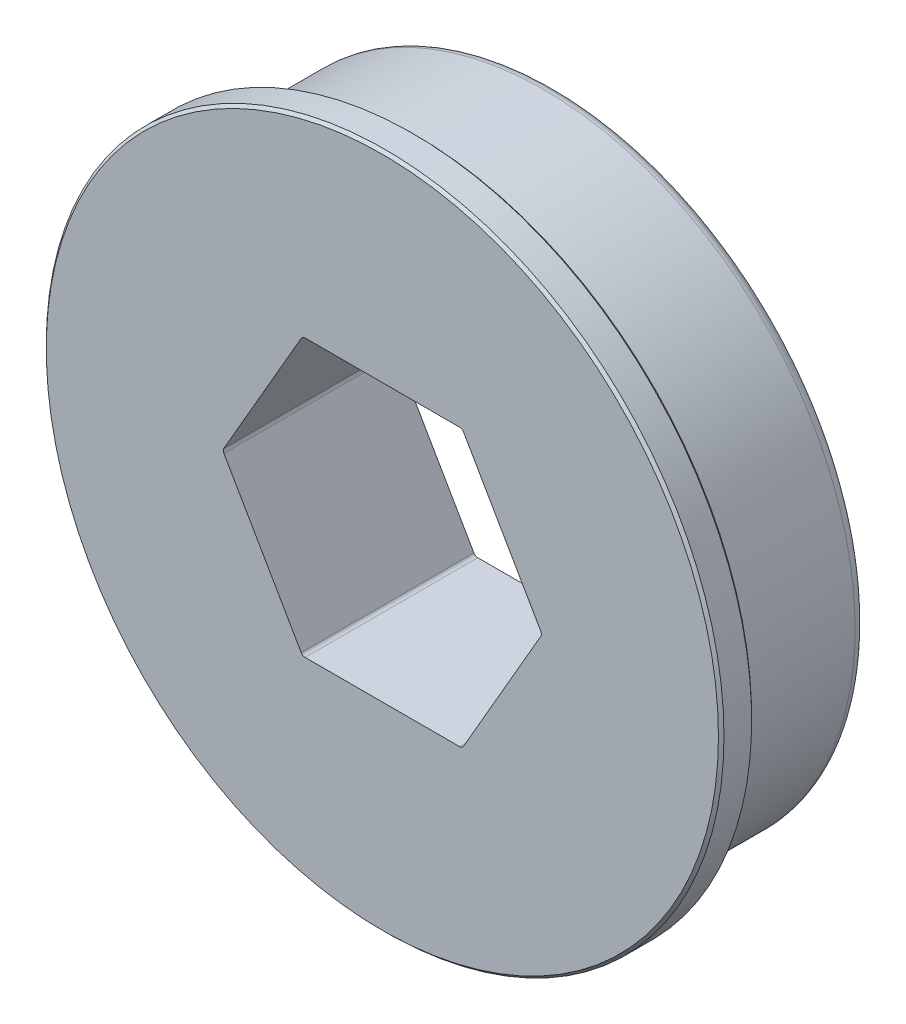
ISO-10303-21;
HEADER;
FILE_DESCRIPTION(('STEP AP214'),'2;1');
FILE_NAME('part.step','',(''),(''),'','','');
FILE_SCHEMA(('AUTOMOTIVE_DESIGN { 1 0 10303 214 1 1 1 1 }'));
ENDSEC;
DATA;
#1=APPLICATION_CONTEXT('core data for automotive mechanical design processes');
#2=APPLICATION_PROTOCOL_DEFINITION('international standard','automotive_design',2000,#1);
#3=PRODUCT_CONTEXT('',#1,'mechanical');
#4=PRODUCT('Part','Part','',(#3));
#5=PRODUCT_RELATED_PRODUCT_CATEGORY('part','',(#4));
#6=PRODUCT_DEFINITION_FORMATION('','',#4);
#7=PRODUCT_DEFINITION_CONTEXT('part definition',#1,'design');
#8=PRODUCT_DEFINITION('design','',#6,#7);
#9=PRODUCT_DEFINITION_SHAPE('','',#8);
#10=(LENGTH_UNIT() NAMED_UNIT(*) SI_UNIT(.MILLI.,.METRE.));
#11=(NAMED_UNIT(*) PLANE_ANGLE_UNIT() SI_UNIT($,.RADIAN.));
#12=(NAMED_UNIT(*) SI_UNIT($,.STERADIAN.) SOLID_ANGLE_UNIT());
#13=UNCERTAINTY_MEASURE_WITH_UNIT(LENGTH_MEASURE(1.E-05),#10,'distance_accuracy_value','');
#14=(GEOMETRIC_REPRESENTATION_CONTEXT(3) GLOBAL_UNCERTAINTY_ASSIGNED_CONTEXT((#13)) GLOBAL_UNIT_ASSIGNED_CONTEXT((#10,
#11,#12)) REPRESENTATION_CONTEXT('',''));
#15=CARTESIAN_POINT('',(0.,0.,0.));
#16=DIRECTION('',(0.,0.,1.));
#17=DIRECTION('',(1.,0.,0.));
#18=AXIS2_PLACEMENT_3D('',#15,#16,#17);
#19=CARTESIAN_POINT('',(0.,0.,7.92734));
#20=DIRECTION('',(0.,0.,-1.));
#21=DIRECTION('',(-1.,0.,0.));
#22=AXIS2_PLACEMENT_3D('',#19,#20,#21);
#23=CYLINDRICAL_SURFACE('',#22,15.5575);
#24=CARTESIAN_POINT('',(0.,0.,6.53034));
#25=DIRECTION('',(0.,0.,-1.));
#26=DIRECTION('',(-1.,0.,0.));
#27=AXIS2_PLACEMENT_3D('',#24,#25,#26);
#28=CIRCLE('',#27,15.5575);
#29=CARTESIAN_POINT('',(-15.5575,0.,6.53034));
#30=VERTEX_POINT('',#29);
#31=EDGE_CURVE('E190',#30,#30,#28,.F.);
#32=ORIENTED_EDGE('',*,*,#31,.T.);
#33=EDGE_LOOP('',(#32));
#34=FACE_BOUND('',#33,.T.);
#35=CARTESIAN_POINT('',(0.,0.,7.80034));
#36=DIRECTION('',(0.,0.,1.));
#37=DIRECTION('',(1.,0.,0.));
#38=AXIS2_PLACEMENT_3D('',#35,#36,#37);
#39=CIRCLE('',#38,15.5575);
#40=CARTESIAN_POINT('',(15.5575,0.,7.80034));
#41=VERTEX_POINT('',#40);
#42=EDGE_CURVE('E187',#41,#41,#39,.F.);
#43=ORIENTED_EDGE('',*,*,#42,.T.);
#44=EDGE_LOOP('',(#43));
#45=FACE_BOUND('',#44,.T.);
#46=ADVANCED_FACE('F39',(#34,#45),#23,.T.);
#47=CARTESIAN_POINT('',(15.5575,0.,7.92734));
#48=DIRECTION('',(0.,0.,1.));
#49=DIRECTION('',(1.,0.,0.));
#50=AXIS2_PLACEMENT_3D('',#47,#48,#49);
#51=PLANE('',#50);
#52=CARTESIAN_POINT('',(0.,0.,7.92734));
#53=DIRECTION('',(0.,0.,1.));
#54=DIRECTION('',(1.,0.,0.));
#55=AXIS2_PLACEMENT_3D('',#52,#53,#54);
#56=CIRCLE('',#55,15.4305);
#57=CARTESIAN_POINT('',(15.4305,0.,7.92734));
#58=VERTEX_POINT('',#57);
#59=EDGE_CURVE('E193',#58,#58,#56,.T.);
#60=ORIENTED_EDGE('',*,*,#59,.T.);
#61=EDGE_LOOP('',(#60));
#62=FACE_BOUND('',#61,.T.);
#63=DIRECTION('',(0.5,-0.866025403784439,0.));
#64=VECTOR('',#63,1.);
#65=CARTESIAN_POINT('',(-7.33234841870824,0.,7.92734));
#66=LINE('',#65,#64);
#67=CARTESIAN_POINT('',(-7.27368963135857,-0.101600000000002,7.92734));
#68=VERTEX_POINT('',#67);
#69=CARTESIAN_POINT('',(-3.72483299670378,-6.2484,7.92734));
#70=VERTEX_POINT('',#69);
#71=EDGE_CURVE('E164',#68,#70,#66,.T.);
#72=ORIENTED_EDGE('',*,*,#71,.F.);
#73=CARTESIAN_POINT('',(-7.09771326930957,0.,7.92734));
#74=DIRECTION('',(0.,0.,1.));
#75=DIRECTION('',(1.,0.,0.));
#76=AXIS2_PLACEMENT_3D('',#73,#74,#75);
#77=CIRCLE('',#76,0.2032);
#78=CARTESIAN_POINT('',(-7.27368963135857,0.101599999999998,7.92734));
#79=VERTEX_POINT('',#78);
#80=EDGE_CURVE('E230',#68,#79,#77,.F.);
#81=ORIENTED_EDGE('',*,*,#80,.T.);
#82=DIRECTION('',(-0.5,-0.866025403784439,0.));
#83=VECTOR('',#82,1.);
#84=CARTESIAN_POINT('',(-3.66617420935411,6.35,7.92734));
#85=LINE('',#84,#83);
#86=CARTESIAN_POINT('',(-3.72483299670378,6.2484,7.92734));
#87=VERTEX_POINT('',#86);
#88=EDGE_CURVE('E170',#87,#79,#85,.T.);
#89=ORIENTED_EDGE('',*,*,#88,.F.);
#90=CARTESIAN_POINT('',(-3.54885663465478,6.1468,7.92734));
#91=DIRECTION('',(0.,0.,1.));
#92=DIRECTION('',(1.,0.,0.));
#93=AXIS2_PLACEMENT_3D('',#90,#91,#92);
#94=CIRCLE('',#93,0.2032);
#95=CARTESIAN_POINT('',(-3.54885663465478,6.35,7.92734));
#96=VERTEX_POINT('',#95);
#97=EDGE_CURVE('E223',#87,#96,#94,.F.);
#98=ORIENTED_EDGE('',*,*,#97,.T.);
#99=DIRECTION('',(-1.,0.,0.));
#100=VECTOR('',#99,1.);
#101=CARTESIAN_POINT('',(3.66617420935413,6.35,7.92734));
#102=LINE('',#101,#100);
#103=CARTESIAN_POINT('',(3.5488566346548,6.35,7.92734));
#104=VERTEX_POINT('',#103);
#105=EDGE_CURVE('E162',#104,#96,#102,.T.);
#106=ORIENTED_EDGE('',*,*,#105,.F.);
#107=CARTESIAN_POINT('',(3.5488566346548,6.1468,7.92734));
#108=DIRECTION('',(0.,0.,1.));
#109=DIRECTION('',(1.,0.,0.));
#110=AXIS2_PLACEMENT_3D('',#107,#108,#109);
#111=CIRCLE('',#110,0.2032);
#112=CARTESIAN_POINT('',(3.7248329967038,6.2484,7.92734));
#113=VERTEX_POINT('',#112);
#114=EDGE_CURVE('E219',#104,#113,#111,.F.);
#115=ORIENTED_EDGE('',*,*,#114,.T.);
#116=DIRECTION('',(-0.5,0.866025403784439,0.));
#117=VECTOR('',#116,1.);
#118=CARTESIAN_POINT('',(7.33234841870826,0.,7.92734));
#119=LINE('',#118,#117);
#120=CARTESIAN_POINT('',(7.27368963135859,0.101599999999991,7.92734));
#121=VERTEX_POINT('',#120);
#122=EDGE_CURVE('E158',#121,#113,#119,.T.);
#123=ORIENTED_EDGE('',*,*,#122,.F.);
#124=CARTESIAN_POINT('',(7.09771326930959,0.,7.92734));
#125=DIRECTION('',(0.,0.,1.));
#126=DIRECTION('',(1.,0.,0.));
#127=AXIS2_PLACEMENT_3D('',#124,#125,#126);
#128=CIRCLE('',#127,0.2032);
#129=CARTESIAN_POINT('',(7.27368963135859,-0.101600000000007,7.92734));
#130=VERTEX_POINT('',#129);
#131=EDGE_CURVE('E157',#121,#130,#128,.F.);
#132=ORIENTED_EDGE('',*,*,#131,.T.);
#133=DIRECTION('',(0.5,0.866025403784439,0.));
#134=VECTOR('',#133,1.);
#135=CARTESIAN_POINT('',(3.66617420935414,-6.35,7.92734));
#136=LINE('',#135,#134);
#137=CARTESIAN_POINT('',(3.7248329967038,-6.2484,7.92734));
#138=VERTEX_POINT('',#137);
#139=EDGE_CURVE('E147',#138,#130,#136,.T.);
#140=ORIENTED_EDGE('',*,*,#139,.F.);
#141=CARTESIAN_POINT('',(3.54885663465481,-6.1468,7.92734));
#142=DIRECTION('',(0.,0.,1.));
#143=DIRECTION('',(1.,0.,0.));
#144=AXIS2_PLACEMENT_3D('',#141,#142,#143);
#145=CIRCLE('',#144,0.2032);
#146=CARTESIAN_POINT('',(3.54885663465481,-6.35,7.92734));
#147=VERTEX_POINT('',#146);
#148=EDGE_CURVE('E130',#138,#147,#145,.F.);
#149=ORIENTED_EDGE('',*,*,#148,.T.);
#150=DIRECTION('',(1.,0.,0.));
#151=VECTOR('',#150,1.);
#152=CARTESIAN_POINT('',(-3.66617420935412,-6.35,7.92734));
#153=LINE('',#152,#151);
#154=CARTESIAN_POINT('',(-3.54885663465479,-6.35,7.92734));
#155=VERTEX_POINT('',#154);
#156=EDGE_CURVE('E159',#155,#147,#153,.T.);
#157=ORIENTED_EDGE('',*,*,#156,.F.);
#158=CARTESIAN_POINT('',(-3.54885663465479,-6.1468,7.92734));
#159=DIRECTION('',(0.,0.,1.));
#160=DIRECTION('',(1.,0.,0.));
#161=AXIS2_PLACEMENT_3D('',#158,#159,#160);
#162=CIRCLE('',#161,0.2032);
#163=EDGE_CURVE('E233',#155,#70,#162,.F.);
#164=ORIENTED_EDGE('',*,*,#163,.T.);
#165=EDGE_LOOP('',(#72,#81,#89,#98,#106,#115,#123,#132,#140,#149,#157,#164));
#166=FACE_BOUND('',#165,.T.);
#167=ADVANCED_FACE('F155',(#62,#166),#51,.T.);
#168=CARTESIAN_POINT('',(0.,0.,0.));
#169=DIRECTION('',(0.,0.,-1.));
#170=DIRECTION('',(-1.,0.,0.));
#171=AXIS2_PLACEMENT_3D('',#168,#169,#170);
#172=PLANE('',#171);
#173=CARTESIAN_POINT('',(0.,0.,0.));
#174=DIRECTION('',(0.,0.,-1.));
#175=DIRECTION('',(-1.,0.,0.));
#176=AXIS2_PLACEMENT_3D('',#173,#174,#175);
#177=CIRCLE('',#176,13.7795);
#178=CARTESIAN_POINT('',(-13.7795,0.,0.));
#179=VERTEX_POINT('',#178);
#180=EDGE_CURVE('E47',#179,#179,#177,.T.);
#181=ORIENTED_EDGE('',*,*,#180,.T.);
#182=EDGE_LOOP('',(#181));
#183=FACE_BOUND('',#182,.T.);
#184=DIRECTION('',(-0.5,-0.866025403784439,0.));
#185=VECTOR('',#184,1.);
#186=CARTESIAN_POINT('',(-3.66617420935411,6.35,0.));
#187=LINE('',#186,#185);
#188=CARTESIAN_POINT('',(-3.72483299670378,6.2484,0.));
#189=VERTEX_POINT('',#188);
#190=CARTESIAN_POINT('',(-7.27368963135857,0.101599999999998,0.));
#191=VERTEX_POINT('',#190);
#192=EDGE_CURVE('E178',#189,#191,#187,.T.);
#193=ORIENTED_EDGE('',*,*,#192,.T.);
#194=CARTESIAN_POINT('',(-7.09771326930957,0.,0.));
#195=DIRECTION('',(0.,0.,-1.));
#196=DIRECTION('',(-1.,0.,0.));
#197=AXIS2_PLACEMENT_3D('',#194,#195,#196);
#198=CIRCLE('',#197,0.2032);
#199=CARTESIAN_POINT('',(-7.27368963135857,-0.101600000000002,0.));
#200=VERTEX_POINT('',#199);
#201=EDGE_CURVE('E61',#191,#200,#198,.F.);
#202=ORIENTED_EDGE('',*,*,#201,.T.);
#203=DIRECTION('',(0.5,-0.866025403784439,0.));
#204=VECTOR('',#203,1.);
#205=CARTESIAN_POINT('',(-7.33234841870824,0.,0.));
#206=LINE('',#205,#204);
#207=CARTESIAN_POINT('',(-3.72483299670378,-6.2484,0.));
#208=VERTEX_POINT('',#207);
#209=EDGE_CURVE('E173',#200,#208,#206,.T.);
#210=ORIENTED_EDGE('',*,*,#209,.T.);
#211=CARTESIAN_POINT('',(-3.54885663465479,-6.1468,0.));
#212=DIRECTION('',(0.,0.,-1.));
#213=DIRECTION('',(-1.,0.,0.));
#214=AXIS2_PLACEMENT_3D('',#211,#212,#213);
#215=CIRCLE('',#214,0.2032);
#216=CARTESIAN_POINT('',(-3.54885663465479,-6.35,0.));
#217=VERTEX_POINT('',#216);
#218=EDGE_CURVE('E235',#208,#217,#215,.F.);
#219=ORIENTED_EDGE('',*,*,#218,.T.);
#220=DIRECTION('',(1.,0.,0.));
#221=VECTOR('',#220,1.);
#222=CARTESIAN_POINT('',(-3.66617420935412,-6.35,0.));
#223=LINE('',#222,#221);
#224=CARTESIAN_POINT('',(3.54885663465481,-6.35,0.));
#225=VERTEX_POINT('',#224);
#226=EDGE_CURVE('E307',#217,#225,#223,.T.);
#227=ORIENTED_EDGE('',*,*,#226,.T.);
#228=CARTESIAN_POINT('',(3.54885663465481,-6.1468,0.));
#229=DIRECTION('',(0.,0.,-1.));
#230=DIRECTION('',(-1.,0.,0.));
#231=AXIS2_PLACEMENT_3D('',#228,#229,#230);
#232=CIRCLE('',#231,0.2032);
#233=CARTESIAN_POINT('',(3.7248329967038,-6.2484,0.));
#234=VERTEX_POINT('',#233);
#235=EDGE_CURVE('E140',#225,#234,#232,.F.);
#236=ORIENTED_EDGE('',*,*,#235,.T.);
#237=DIRECTION('',(0.5,0.866025403784439,0.));
#238=VECTOR('',#237,1.);
#239=CARTESIAN_POINT('',(3.66617420935414,-6.35,0.));
#240=LINE('',#239,#238);
#241=CARTESIAN_POINT('',(7.27368963135859,-0.101600000000007,0.));
#242=VERTEX_POINT('',#241);
#243=EDGE_CURVE('E150',#234,#242,#240,.T.);
#244=ORIENTED_EDGE('',*,*,#243,.T.);
#245=CARTESIAN_POINT('',(7.09771326930959,0.,0.));
#246=DIRECTION('',(0.,0.,-1.));
#247=DIRECTION('',(-1.,0.,0.));
#248=AXIS2_PLACEMENT_3D('',#245,#246,#247);
#249=CIRCLE('',#248,0.2032);
#250=CARTESIAN_POINT('',(7.27368963135859,0.101599999999991,0.));
#251=VERTEX_POINT('',#250);
#252=EDGE_CURVE('E228',#242,#251,#249,.F.);
#253=ORIENTED_EDGE('',*,*,#252,.T.);
#254=DIRECTION('',(-0.5,0.866025403784439,0.));
#255=VECTOR('',#254,1.);
#256=CARTESIAN_POINT('',(7.33234841870826,0.,0.));
#257=LINE('',#256,#255);
#258=CARTESIAN_POINT('',(3.7248329967038,6.2484,0.));
#259=VERTEX_POINT('',#258);
#260=EDGE_CURVE('E303',#251,#259,#257,.T.);
#261=ORIENTED_EDGE('',*,*,#260,.T.);
#262=CARTESIAN_POINT('',(3.5488566346548,6.1468,0.));
#263=DIRECTION('',(0.,0.,-1.));
#264=DIRECTION('',(-1.,0.,0.));
#265=AXIS2_PLACEMENT_3D('',#262,#263,#264);
#266=CIRCLE('',#265,0.2032);
#267=CARTESIAN_POINT('',(3.5488566346548,6.35,0.));
#268=VERTEX_POINT('',#267);
#269=EDGE_CURVE('E221',#259,#268,#266,.F.);
#270=ORIENTED_EDGE('',*,*,#269,.T.);
#271=DIRECTION('',(-1.,0.,0.));
#272=VECTOR('',#271,1.);
#273=CARTESIAN_POINT('',(3.66617420935413,6.35,0.));
#274=LINE('',#273,#272);
#275=CARTESIAN_POINT('',(-3.54885663465478,6.35,0.));
#276=VERTEX_POINT('',#275);
#277=EDGE_CURVE('E300',#268,#276,#274,.T.);
#278=ORIENTED_EDGE('',*,*,#277,.T.);
#279=CARTESIAN_POINT('',(-3.54885663465478,6.1468,0.));
#280=DIRECTION('',(0.,0.,-1.));
#281=DIRECTION('',(-1.,0.,0.));
#282=AXIS2_PLACEMENT_3D('',#279,#280,#281);
#283=CIRCLE('',#282,0.2032);
#284=EDGE_CURVE('E225',#276,#189,#283,.F.);
#285=ORIENTED_EDGE('',*,*,#284,.T.);
#286=EDGE_LOOP('',(#193,#202,#210,#219,#227,#236,#244,#253,#261,#270,#278,#285));
#287=FACE_BOUND('',#286,.T.);
#288=ADVANCED_FACE('F239',(#183,#287),#172,.T.);
#289=CARTESIAN_POINT('',(0.,0.,7.92734));
#290=DIRECTION('',(0.,0.,-1.));
#291=DIRECTION('',(-1.,0.,0.));
#292=AXIS2_PLACEMENT_3D('',#289,#290,#291);
#293=CYLINDRICAL_SURFACE('',#292,14.2875);
#294=CARTESIAN_POINT('',(0.,0.,0.508));
#295=DIRECTION('',(0.,0.,-1.));
#296=DIRECTION('',(-1.,0.,0.));
#297=AXIS2_PLACEMENT_3D('',#294,#295,#296);
#298=CIRCLE('',#297,14.2875);
#299=CARTESIAN_POINT('',(-14.2875,0.,0.508));
#300=VERTEX_POINT('',#299);
#301=EDGE_CURVE('E11',#300,#300,#298,.F.);
#302=ORIENTED_EDGE('',*,*,#301,.T.);
#303=EDGE_LOOP('',(#302));
#304=FACE_BOUND('',#303,.T.);
#305=CARTESIAN_POINT('',(0.,0.,5.89534));
#306=DIRECTION('',(0.,0.,-1.));
#307=DIRECTION('',(-1.,0.,0.));
#308=AXIS2_PLACEMENT_3D('',#305,#306,#307);
#309=CIRCLE('',#308,14.2875);
#310=CARTESIAN_POINT('',(-14.2875,0.,5.89534));
#311=VERTEX_POINT('',#310);
#312=EDGE_CURVE('E181',#311,#311,#309,.T.);
#313=ORIENTED_EDGE('',*,*,#312,.T.);
#314=EDGE_LOOP('',(#313));
#315=FACE_BOUND('',#314,.T.);
#316=ADVANCED_FACE('F358',(#304,#315),#293,.T.);
#317=CARTESIAN_POINT('',(14.2875,0.,5.89534));
#318=DIRECTION('',(0.,0.,1.));
#319=DIRECTION('',(1.,0.,0.));
#320=AXIS2_PLACEMENT_3D('',#317,#318,#319);
#321=PLANE('',#320);
#322=CARTESIAN_POINT('',(0.,0.,5.89534));
#323=DIRECTION('',(0.,0.,-1.));
#324=DIRECTION('',(-1.,0.,0.));
#325=AXIS2_PLACEMENT_3D('',#322,#323,#324);
#326=CIRCLE('',#325,13.97);
#327=CARTESIAN_POINT('',(-13.97,0.,5.89534));
#328=VERTEX_POINT('',#327);
#329=EDGE_CURVE('E177',#328,#328,#326,.T.);
#330=ORIENTED_EDGE('',*,*,#329,.T.);
#331=EDGE_LOOP('',(#330));
#332=FACE_BOUND('',#331,.T.);
#333=ORIENTED_EDGE('',*,*,#312,.F.);
#334=EDGE_LOOP('',(#333));
#335=FACE_BOUND('',#334,.T.);
#336=ADVANCED_FACE('F354',(#332,#335),#321,.T.);
#337=CARTESIAN_POINT('',(0.,0.,7.92734));
#338=DIRECTION('',(0.,0.,-1.));
#339=DIRECTION('',(-1.,0.,0.));
#340=AXIS2_PLACEMENT_3D('',#337,#338,#339);
#341=CYLINDRICAL_SURFACE('',#340,13.97);
#342=CARTESIAN_POINT('',(0.,0.,6.40334));
#343=DIRECTION('',(0.,0.,-1.));
#344=DIRECTION('',(-1.,0.,0.));
#345=AXIS2_PLACEMENT_3D('',#342,#343,#344);
#346=CIRCLE('',#345,13.97);
#347=CARTESIAN_POINT('',(-13.97,0.,6.40334));
#348=VERTEX_POINT('',#347);
#349=EDGE_CURVE('E174',#348,#348,#346,.T.);
#350=ORIENTED_EDGE('',*,*,#349,.T.);
#351=EDGE_LOOP('',(#350));
#352=FACE_BOUND('',#351,.T.);
#353=ORIENTED_EDGE('',*,*,#329,.F.);
#354=EDGE_LOOP('',(#353));
#355=FACE_BOUND('',#354,.T.);
#356=ADVANCED_FACE('F350',(#352,#355),#341,.T.);
#357=CARTESIAN_POINT('',(13.97,0.,6.40334));
#358=DIRECTION('',(0.,0.,-1.));
#359=DIRECTION('',(-1.,0.,0.));
#360=AXIS2_PLACEMENT_3D('',#357,#358,#359);
#361=PLANE('',#360);
#362=CARTESIAN_POINT('',(0.,0.,6.40334));
#363=DIRECTION('',(0.,0.,-1.));
#364=DIRECTION('',(-1.,0.,0.));
#365=AXIS2_PLACEMENT_3D('',#362,#363,#364);
#366=CIRCLE('',#365,15.4305);
#367=CARTESIAN_POINT('',(-15.4305,0.,6.40334));
#368=VERTEX_POINT('',#367);
#369=EDGE_CURVE('E184',#368,#368,#366,.T.);
#370=ORIENTED_EDGE('',*,*,#369,.T.);
#371=EDGE_LOOP('',(#370));
#372=FACE_BOUND('',#371,.T.);
#373=ORIENTED_EDGE('',*,*,#349,.F.);
#374=EDGE_LOOP('',(#373));
#375=FACE_BOUND('',#374,.T.);
#376=ADVANCED_FACE('F339',(#372,#375),#361,.T.);
#377=CARTESIAN_POINT('',(-7.33234841870824,0.,0.));
#378=DIRECTION('',(-0.866025403784439,-0.5,0.));
#379=DIRECTION('',(0.5,-0.866025403784439,0.));
#380=AXIS2_PLACEMENT_3D('',#377,#378,#379);
#381=PLANE('',#380);
#382=ORIENTED_EDGE('',*,*,#209,.F.);
#383=DIRECTION('',(0.,0.,1.));
#384=VECTOR('',#383,1.);
#385=CARTESIAN_POINT('',(-7.27368963135857,-0.101600000000002,7.92734));
#386=LINE('',#385,#384);
#387=EDGE_CURVE('E141',#200,#68,#386,.T.);
#388=ORIENTED_EDGE('',*,*,#387,.T.);
#389=ORIENTED_EDGE('',*,*,#71,.T.);
#390=DIRECTION('',(0.,0.,1.));
#391=VECTOR('',#390,1.);
#392=CARTESIAN_POINT('',(-3.72483299670378,-6.2484,0.));
#393=LINE('',#392,#391);
#394=EDGE_CURVE('E54',#70,#208,#393,.F.);
#395=ORIENTED_EDGE('',*,*,#394,.T.);
#396=EDGE_LOOP('',(#382,#388,#389,#395));
#397=FACE_BOUND('',#396,.T.);
#398=ADVANCED_FACE('F296',(#397),#381,.F.);
#399=CARTESIAN_POINT('',(-3.66617420935411,6.35,0.));
#400=DIRECTION('',(-0.866025403784439,0.5,0.));
#401=DIRECTION('',(-0.5,-0.866025403784439,0.));
#402=AXIS2_PLACEMENT_3D('',#399,#400,#401);
#403=PLANE('',#402);
#404=ORIENTED_EDGE('',*,*,#192,.F.);
#405=DIRECTION('',(0.,0.,1.));
#406=VECTOR('',#405,1.);
#407=CARTESIAN_POINT('',(-3.72483299670378,6.2484,7.92734));
#408=LINE('',#407,#406);
#409=EDGE_CURVE('E212',#189,#87,#408,.T.);
#410=ORIENTED_EDGE('',*,*,#409,.T.);
#411=ORIENTED_EDGE('',*,*,#88,.T.);
#412=DIRECTION('',(0.,0.,1.));
#413=VECTOR('',#412,1.);
#414=CARTESIAN_POINT('',(-7.27368963135857,0.101599999999998,0.));
#415=LINE('',#414,#413);
#416=EDGE_CURVE('E210',#79,#191,#415,.F.);
#417=ORIENTED_EDGE('',*,*,#416,.T.);
#418=EDGE_LOOP('',(#404,#410,#411,#417));
#419=FACE_BOUND('',#418,.T.);
#420=ADVANCED_FACE('F331',(#419),#403,.F.);
#421=CARTESIAN_POINT('',(3.66617420935413,6.35,0.));
#422=DIRECTION('',(0.,1.,0.));
#423=DIRECTION('',(0.,0.,1.));
#424=AXIS2_PLACEMENT_3D('',#421,#422,#423);
#425=PLANE('',#424);
#426=ORIENTED_EDGE('',*,*,#277,.F.);
#427=DIRECTION('',(0.,0.,1.));
#428=VECTOR('',#427,1.);
#429=CARTESIAN_POINT('',(3.5488566346548,6.35,7.92734));
#430=LINE('',#429,#428);
#431=EDGE_CURVE('E202',#268,#104,#430,.T.);
#432=ORIENTED_EDGE('',*,*,#431,.T.);
#433=ORIENTED_EDGE('',*,*,#105,.T.);
#434=DIRECTION('',(0.,0.,1.));
#435=VECTOR('',#434,1.);
#436=CARTESIAN_POINT('',(-3.54885663465478,6.35,0.));
#437=LINE('',#436,#435);
#438=EDGE_CURVE('E200',#96,#276,#437,.F.);
#439=ORIENTED_EDGE('',*,*,#438,.T.);
#440=EDGE_LOOP('',(#426,#432,#433,#439));
#441=FACE_BOUND('',#440,.T.);
#442=ADVANCED_FACE('F325',(#441),#425,.F.);
#443=CARTESIAN_POINT('',(7.33234841870826,0.,0.));
#444=DIRECTION('',(0.866025403784439,0.5,0.));
#445=DIRECTION('',(-0.5,0.866025403784439,0.));
#446=AXIS2_PLACEMENT_3D('',#443,#444,#445);
#447=PLANE('',#446);
#448=ORIENTED_EDGE('',*,*,#122,.T.);
#449=DIRECTION('',(0.,0.,1.));
#450=VECTOR('',#449,1.);
#451=CARTESIAN_POINT('',(3.7248329967038,6.2484,0.));
#452=LINE('',#451,#450);
#453=EDGE_CURVE('E208',#113,#259,#452,.F.);
#454=ORIENTED_EDGE('',*,*,#453,.T.);
#455=ORIENTED_EDGE('',*,*,#260,.F.);
#456=DIRECTION('',(0.,0.,1.));
#457=VECTOR('',#456,1.);
#458=CARTESIAN_POINT('',(7.27368963135859,0.101599999999991,7.92734));
#459=LINE('',#458,#457);
#460=EDGE_CURVE('E205',#251,#121,#459,.T.);
#461=ORIENTED_EDGE('',*,*,#460,.T.);
#462=EDGE_LOOP('',(#448,#454,#455,#461));
#463=FACE_BOUND('',#462,.T.);
#464=ADVANCED_FACE('F318',(#463),#447,.F.);
#465=CARTESIAN_POINT('',(3.66617420935414,-6.35,0.));
#466=DIRECTION('',(0.866025403784439,-0.5,0.));
#467=DIRECTION('',(0.5,0.866025403784439,0.));
#468=AXIS2_PLACEMENT_3D('',#465,#466,#467);
#469=PLANE('',#468);
#470=ORIENTED_EDGE('',*,*,#243,.F.);
#471=DIRECTION('',(0.,0.,1.));
#472=VECTOR('',#471,1.);
#473=CARTESIAN_POINT('',(3.7248329967038,-6.2484,7.92734));
#474=LINE('',#473,#472);
#475=EDGE_CURVE('E134',#234,#138,#474,.T.);
#476=ORIENTED_EDGE('',*,*,#475,.T.);
#477=ORIENTED_EDGE('',*,*,#139,.T.);
#478=DIRECTION('',(0.,0.,1.));
#479=VECTOR('',#478,1.);
#480=CARTESIAN_POINT('',(7.27368963135859,-0.101600000000008,0.));
#481=LINE('',#480,#479);
#482=EDGE_CURVE('E152',#130,#242,#481,.F.);
#483=ORIENTED_EDGE('',*,*,#482,.T.);
#484=EDGE_LOOP('',(#470,#476,#477,#483));
#485=FACE_BOUND('',#484,.T.);
#486=ADVANCED_FACE('F146',(#485),#469,.F.);
#487=CARTESIAN_POINT('',(-3.66617420935412,-6.35,0.));
#488=DIRECTION('',(0.,-1.,0.));
#489=DIRECTION('',(0.,0.,-1.));
#490=AXIS2_PLACEMENT_3D('',#487,#488,#489);
#491=PLANE('',#490);
#492=ORIENTED_EDGE('',*,*,#156,.T.);
#493=DIRECTION('',(0.,0.,1.));
#494=VECTOR('',#493,1.);
#495=CARTESIAN_POINT('',(3.54885663465481,-6.35,0.));
#496=LINE('',#495,#494);
#497=EDGE_CURVE('E135',#147,#225,#496,.F.);
#498=ORIENTED_EDGE('',*,*,#497,.T.);
#499=ORIENTED_EDGE('',*,*,#226,.F.);
#500=DIRECTION('',(0.,0.,1.));
#501=VECTOR('',#500,1.);
#502=CARTESIAN_POINT('',(-3.54885663465479,-6.35,7.92734));
#503=LINE('',#502,#501);
#504=EDGE_CURVE('E151',#217,#155,#503,.T.);
#505=ORIENTED_EDGE('',*,*,#504,.T.);
#506=EDGE_LOOP('',(#492,#498,#499,#505));
#507=FACE_BOUND('',#506,.T.);
#508=ADVANCED_FACE('F269',(#507),#491,.F.);
#509=CARTESIAN_POINT('',(0.,0.,6.40334));
#510=DIRECTION('',(0.,0.,1.));
#511=DIRECTION('',(1.,0.,0.));
#512=AXIS2_PLACEMENT_3D('',#509,#510,#511);
#513=CONICAL_SURFACE('',#512,15.4305,0.785398163397435);
#514=ORIENTED_EDGE('',*,*,#31,.F.);
#515=EDGE_LOOP('',(#514));
#516=FACE_BOUND('',#515,.T.);
#517=ORIENTED_EDGE('',*,*,#369,.F.);
#518=EDGE_LOOP('',(#517));
#519=FACE_BOUND('',#518,.T.);
#520=ADVANCED_FACE('F262',(#516,#519),#513,.T.);
#521=CARTESIAN_POINT('',(0.,0.,7.80034));
#522=DIRECTION('',(0.,0.,-1.));
#523=DIRECTION('',(-1.,0.,0.));
#524=AXIS2_PLACEMENT_3D('',#521,#522,#523);
#525=CONICAL_SURFACE('',#524,15.5575,0.785398163397442);
#526=ORIENTED_EDGE('',*,*,#59,.F.);
#527=EDGE_LOOP('',(#526));
#528=FACE_BOUND('',#527,.T.);
#529=ORIENTED_EDGE('',*,*,#42,.F.);
#530=EDGE_LOOP('',(#529));
#531=FACE_BOUND('',#530,.T.);
#532=ADVANCED_FACE('F268',(#528,#531),#525,.T.);
#533=CARTESIAN_POINT('',(3.54885663465481,-6.1468,0.));
#534=DIRECTION('',(0.,0.,-1.));
#535=DIRECTION('',(-1.,0.,0.));
#536=AXIS2_PLACEMENT_3D('',#533,#534,#535);
#537=CYLINDRICAL_SURFACE('',#536,0.2032);
#538=ORIENTED_EDGE('',*,*,#235,.F.);
#539=ORIENTED_EDGE('',*,*,#497,.F.);
#540=ORIENTED_EDGE('',*,*,#148,.F.);
#541=ORIENTED_EDGE('',*,*,#475,.F.);
#542=EDGE_LOOP('',(#538,#539,#540,#541));
#543=FACE_BOUND('',#542,.T.);
#544=ADVANCED_FACE('F133',(#543),#537,.F.);
#545=CARTESIAN_POINT('',(3.5488566346548,6.1468,0.));
#546=DIRECTION('',(0.,0.,-1.));
#547=DIRECTION('',(-1.,0.,0.));
#548=AXIS2_PLACEMENT_3D('',#545,#546,#547);
#549=CYLINDRICAL_SURFACE('',#548,0.2032);
#550=ORIENTED_EDGE('',*,*,#269,.F.);
#551=ORIENTED_EDGE('',*,*,#453,.F.);
#552=ORIENTED_EDGE('',*,*,#114,.F.);
#553=ORIENTED_EDGE('',*,*,#431,.F.);
#554=EDGE_LOOP('',(#550,#551,#552,#553));
#555=FACE_BOUND('',#554,.T.);
#556=ADVANCED_FACE('F278',(#555),#549,.F.);
#557=CARTESIAN_POINT('',(-3.54885663465478,6.1468,0.));
#558=DIRECTION('',(0.,0.,-1.));
#559=DIRECTION('',(-1.,0.,0.));
#560=AXIS2_PLACEMENT_3D('',#557,#558,#559);
#561=CYLINDRICAL_SURFACE('',#560,0.2032);
#562=ORIENTED_EDGE('',*,*,#284,.F.);
#563=ORIENTED_EDGE('',*,*,#438,.F.);
#564=ORIENTED_EDGE('',*,*,#97,.F.);
#565=ORIENTED_EDGE('',*,*,#409,.F.);
#566=EDGE_LOOP('',(#562,#563,#564,#565));
#567=FACE_BOUND('',#566,.T.);
#568=ADVANCED_FACE('F281',(#567),#561,.F.);
#569=CARTESIAN_POINT('',(7.09771326930959,0.,0.));
#570=DIRECTION('',(0.,0.,-1.));
#571=DIRECTION('',(-1.,0.,0.));
#572=AXIS2_PLACEMENT_3D('',#569,#570,#571);
#573=CYLINDRICAL_SURFACE('',#572,0.2032);
#574=ORIENTED_EDGE('',*,*,#252,.F.);
#575=ORIENTED_EDGE('',*,*,#482,.F.);
#576=ORIENTED_EDGE('',*,*,#131,.F.);
#577=ORIENTED_EDGE('',*,*,#460,.F.);
#578=EDGE_LOOP('',(#574,#575,#576,#577));
#579=FACE_BOUND('',#578,.T.);
#580=ADVANCED_FACE('F285',(#579),#573,.F.);
#581=CARTESIAN_POINT('',(-7.09771326930957,0.,0.));
#582=DIRECTION('',(0.,0.,-1.));
#583=DIRECTION('',(-1.,0.,0.));
#584=AXIS2_PLACEMENT_3D('',#581,#582,#583);
#585=CYLINDRICAL_SURFACE('',#584,0.2032);
#586=ORIENTED_EDGE('',*,*,#201,.F.);
#587=ORIENTED_EDGE('',*,*,#416,.F.);
#588=ORIENTED_EDGE('',*,*,#80,.F.);
#589=ORIENTED_EDGE('',*,*,#387,.F.);
#590=EDGE_LOOP('',(#586,#587,#588,#589));
#591=FACE_BOUND('',#590,.T.);
#592=ADVANCED_FACE('F247',(#591),#585,.F.);
#593=CARTESIAN_POINT('',(-3.54885663465479,-6.1468,0.));
#594=DIRECTION('',(0.,0.,-1.));
#595=DIRECTION('',(-1.,0.,0.));
#596=AXIS2_PLACEMENT_3D('',#593,#594,#595);
#597=CYLINDRICAL_SURFACE('',#596,0.2032);
#598=ORIENTED_EDGE('',*,*,#218,.F.);
#599=ORIENTED_EDGE('',*,*,#394,.F.);
#600=ORIENTED_EDGE('',*,*,#163,.F.);
#601=ORIENTED_EDGE('',*,*,#504,.F.);
#602=EDGE_LOOP('',(#598,#599,#600,#601));
#603=FACE_BOUND('',#602,.T.);
#604=ADVANCED_FACE('F242',(#603),#597,.F.);
#605=CARTESIAN_POINT('',(0.,0.,0.508));
#606=DIRECTION('',(0.,0.,-1.));
#607=DIRECTION('',(-1.,0.,0.));
#608=AXIS2_PLACEMENT_3D('',#605,#606,#607);
#609=TOROIDAL_SURFACE('',#608,13.7795,0.508);
#610=ORIENTED_EDGE('',*,*,#301,.F.);
#611=EDGE_LOOP('',(#610));
#612=FACE_BOUND('',#611,.T.);
#613=ORIENTED_EDGE('',*,*,#180,.F.);
#614=EDGE_LOOP('',(#613));
#615=FACE_BOUND('',#614,.T.);
#616=ADVANCED_FACE('F41',(#612,#615),#609,.T.);
#617=CLOSED_SHELL('',(#46,#167,#288,#316,#336,#356,#376,#398,#420,#442,#464,#486,#508,#520,#532,
#544,#556,#568,#580,#592,#604,#616));
#618=MANIFOLD_SOLID_BREP('B2',#617);
#619=ADVANCED_BREP_SHAPE_REPRESENTATION('',(#18,#618),#14);
#620=SHAPE_DEFINITION_REPRESENTATION(#9,#619);
ENDSEC;
END-ISO-10303-21;
